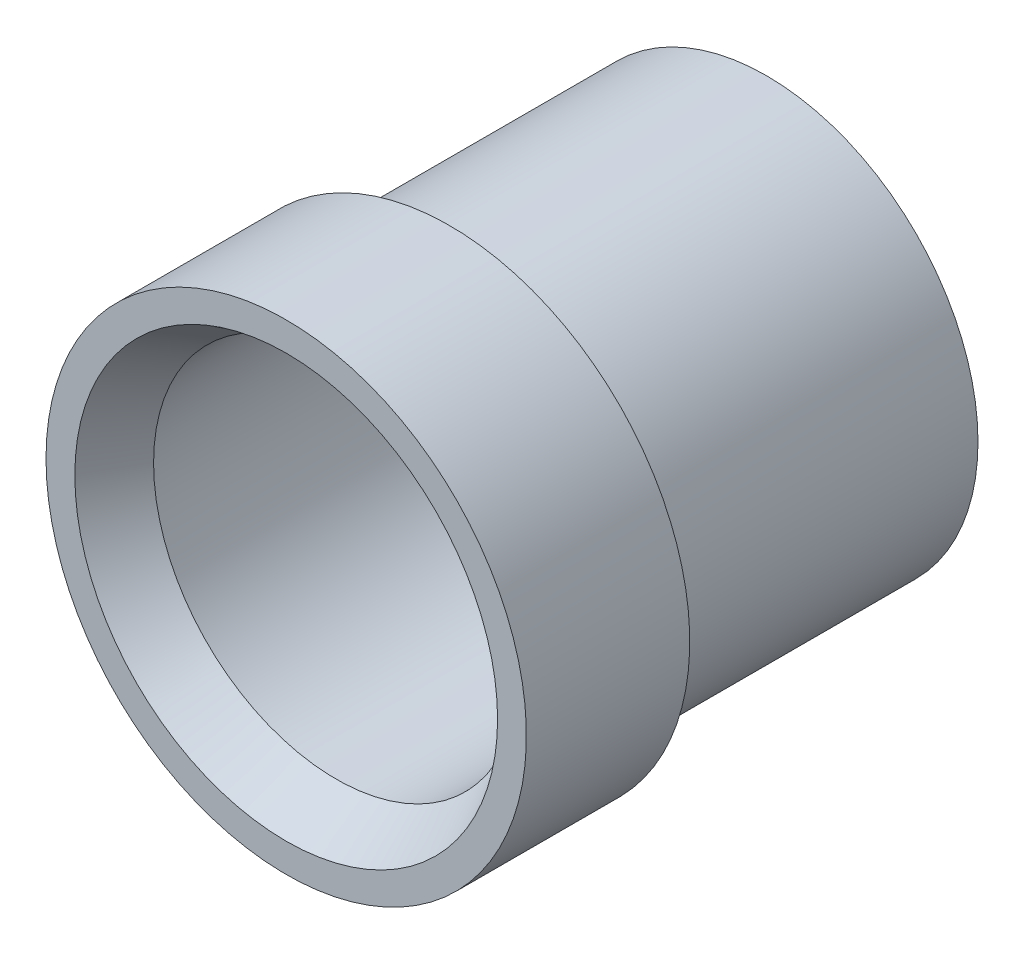
ISO-10303-21;
HEADER;
FILE_DESCRIPTION(('STEP AP214'),'2;1');
FILE_NAME('part.step','',(''),(''),'','','');
FILE_SCHEMA(('AUTOMOTIVE_DESIGN { 1 0 10303 214 1 1 1 1 }'));
ENDSEC;
DATA;
#1=APPLICATION_CONTEXT('core data for automotive mechanical design processes');
#2=APPLICATION_PROTOCOL_DEFINITION('international standard','automotive_design',2000,#1);
#3=PRODUCT_CONTEXT('',#1,'mechanical');
#4=PRODUCT('Part','Part','',(#3));
#5=PRODUCT_RELATED_PRODUCT_CATEGORY('part','',(#4));
#6=PRODUCT_DEFINITION_FORMATION('','',#4);
#7=PRODUCT_DEFINITION_CONTEXT('part definition',#1,'design');
#8=PRODUCT_DEFINITION('design','',#6,#7);
#9=PRODUCT_DEFINITION_SHAPE('','',#8);
#10=(LENGTH_UNIT() NAMED_UNIT(*) SI_UNIT(.MILLI.,.METRE.));
#11=(NAMED_UNIT(*) PLANE_ANGLE_UNIT() SI_UNIT($,.RADIAN.));
#12=(NAMED_UNIT(*) SI_UNIT($,.STERADIAN.) SOLID_ANGLE_UNIT());
#13=UNCERTAINTY_MEASURE_WITH_UNIT(LENGTH_MEASURE(1.E-05),#10,'distance_accuracy_value','');
#14=(GEOMETRIC_REPRESENTATION_CONTEXT(3) GLOBAL_UNCERTAINTY_ASSIGNED_CONTEXT((#13)) GLOBAL_UNIT_ASSIGNED_CONTEXT((#10,
#11,#12)) REPRESENTATION_CONTEXT('',''));
#15=CARTESIAN_POINT('',(0.,0.,0.));
#16=DIRECTION('',(0.,0.,1.));
#17=DIRECTION('',(1.,0.,0.));
#18=AXIS2_PLACEMENT_3D('',#15,#16,#17);
#19=CARTESIAN_POINT('',(0.,6.35,6.35));
#20=DIRECTION('',(0.,0.,1.));
#21=DIRECTION('',(1.,0.,0.));
#22=AXIS2_PLACEMENT_3D('',#19,#20,#21);
#23=PLANE('',#22);
#24=CARTESIAN_POINT('',(0.,0.,6.35));
#25=DIRECTION('',(0.,0.,-1.));
#26=DIRECTION('',(-1.,0.,0.));
#27=AXIS2_PLACEMENT_3D('',#24,#25,#26);
#28=CIRCLE('',#27,5.588);
#29=CARTESIAN_POINT('',(-5.588,0.,6.35));
#30=VERTEX_POINT('',#29);
#31=EDGE_CURVE('E10',#30,#30,#28,.T.);
#32=ORIENTED_EDGE('',*,*,#31,.T.);
#33=EDGE_LOOP('',(#32));
#34=FACE_BOUND('',#33,.T.);
#35=CARTESIAN_POINT('',(0.,0.,6.35));
#36=DIRECTION('',(0.,0.,-1.));
#37=DIRECTION('',(-1.,0.,0.));
#38=AXIS2_PLACEMENT_3D('',#35,#36,#37);
#39=CIRCLE('',#38,6.35);
#40=CARTESIAN_POINT('',(-6.35,0.,6.35));
#41=VERTEX_POINT('',#40);
#42=EDGE_CURVE('E58',#41,#41,#39,.T.);
#43=ORIENTED_EDGE('',*,*,#42,.F.);
#44=EDGE_LOOP('',(#43));
#45=FACE_BOUND('',#44,.T.);
#46=ADVANCED_FACE('F33',(#34,#45),#23,.T.);
#47=CARTESIAN_POINT('',(0.,0.,6.35));
#48=DIRECTION('',(0.,0.,1.));
#49=DIRECTION('',(1.,0.,0.));
#50=AXIS2_PLACEMENT_3D('',#47,#48,#49);
#51=CONICAL_SURFACE('',#50,5.588,0.523598775598299);
#52=CARTESIAN_POINT('',(0.,0.,5.03017728463252));
#53=DIRECTION('',(0.,0.,-1.));
#54=DIRECTION('',(-1.,0.,0.));
#55=AXIS2_PLACEMENT_3D('',#52,#53,#54);
#56=CIRCLE('',#55,4.826);
#57=CARTESIAN_POINT('',(-4.826,0.,5.03017728463252));
#58=VERTEX_POINT('',#57);
#59=EDGE_CURVE('E39',#58,#58,#56,.T.);
#60=ORIENTED_EDGE('',*,*,#59,.T.);
#61=EDGE_LOOP('',(#60));
#62=FACE_BOUND('',#61,.T.);
#63=ORIENTED_EDGE('',*,*,#31,.F.);
#64=EDGE_LOOP('',(#63));
#65=FACE_BOUND('',#64,.T.);
#66=ADVANCED_FACE('F66',(#62,#65),#51,.F.);
#67=CARTESIAN_POINT('',(0.,0.,-6.35));
#68=DIRECTION('',(0.,0.,-1.));
#69=DIRECTION('',(-1.,0.,0.));
#70=AXIS2_PLACEMENT_3D('',#67,#68,#69);
#71=CYLINDRICAL_SURFACE('',#70,4.826);
#72=CARTESIAN_POINT('',(0.,0.,-6.35));
#73=DIRECTION('',(0.,0.,-1.));
#74=DIRECTION('',(-1.,0.,0.));
#75=AXIS2_PLACEMENT_3D('',#72,#73,#74);
#76=CIRCLE('',#75,4.826);
#77=CARTESIAN_POINT('',(-4.826,0.,-6.35));
#78=VERTEX_POINT('',#77);
#79=EDGE_CURVE('E43',#78,#78,#76,.T.);
#80=ORIENTED_EDGE('',*,*,#79,.T.);
#81=EDGE_LOOP('',(#80));
#82=FACE_BOUND('',#81,.T.);
#83=ORIENTED_EDGE('',*,*,#59,.F.);
#84=EDGE_LOOP('',(#83));
#85=FACE_BOUND('',#84,.T.);
#86=ADVANCED_FACE('F70',(#82,#85),#71,.F.);
#87=CARTESIAN_POINT('',(0.,4.826,-6.35));
#88=DIRECTION('',(0.,0.,-1.));
#89=DIRECTION('',(-1.,0.,0.));
#90=AXIS2_PLACEMENT_3D('',#87,#88,#89);
#91=PLANE('',#90);
#92=CARTESIAN_POINT('',(0.,0.,-6.35));
#93=DIRECTION('',(0.,0.,-1.));
#94=DIRECTION('',(-1.,0.,0.));
#95=AXIS2_PLACEMENT_3D('',#92,#93,#94);
#96=CIRCLE('',#95,5.588);
#97=CARTESIAN_POINT('',(-5.588,0.,-6.35));
#98=VERTEX_POINT('',#97);
#99=EDGE_CURVE('E47',#98,#98,#96,.T.);
#100=ORIENTED_EDGE('',*,*,#99,.T.);
#101=EDGE_LOOP('',(#100));
#102=FACE_BOUND('',#101,.T.);
#103=ORIENTED_EDGE('',*,*,#79,.F.);
#104=EDGE_LOOP('',(#103));
#105=FACE_BOUND('',#104,.T.);
#106=ADVANCED_FACE('F74',(#102,#105),#91,.T.);
#107=CARTESIAN_POINT('',(0.,0.,-6.35));
#108=DIRECTION('',(0.,0.,-1.));
#109=DIRECTION('',(-1.,0.,0.));
#110=AXIS2_PLACEMENT_3D('',#107,#108,#109);
#111=CYLINDRICAL_SURFACE('',#110,5.588);
#112=CARTESIAN_POINT('',(0.,0.,2.032));
#113=DIRECTION('',(0.,0.,-1.));
#114=DIRECTION('',(-1.,0.,0.));
#115=AXIS2_PLACEMENT_3D('',#112,#113,#114);
#116=CIRCLE('',#115,5.588);
#117=CARTESIAN_POINT('',(-5.588,0.,2.032));
#118=VERTEX_POINT('',#117);
#119=EDGE_CURVE('E52',#118,#118,#116,.T.);
#120=ORIENTED_EDGE('',*,*,#119,.T.);
#121=EDGE_LOOP('',(#120));
#122=FACE_BOUND('',#121,.T.);
#123=ORIENTED_EDGE('',*,*,#99,.F.);
#124=EDGE_LOOP('',(#123));
#125=FACE_BOUND('',#124,.T.);
#126=ADVANCED_FACE('F81',(#122,#125),#111,.T.);
#127=CARTESIAN_POINT('',(0.,5.588,2.032));
#128=DIRECTION('',(0.,0.,-1.));
#129=DIRECTION('',(-1.,0.,0.));
#130=AXIS2_PLACEMENT_3D('',#127,#128,#129);
#131=PLANE('',#130);
#132=CARTESIAN_POINT('',(0.,0.,2.032));
#133=DIRECTION('',(0.,0.,-1.));
#134=DIRECTION('',(-1.,0.,0.));
#135=AXIS2_PLACEMENT_3D('',#132,#133,#134);
#136=CIRCLE('',#135,6.35);
#137=CARTESIAN_POINT('',(-6.35,0.,2.032));
#138=VERTEX_POINT('',#137);
#139=EDGE_CURVE('E55',#138,#138,#136,.T.);
#140=ORIENTED_EDGE('',*,*,#139,.T.);
#141=EDGE_LOOP('',(#140));
#142=FACE_BOUND('',#141,.T.);
#143=ORIENTED_EDGE('',*,*,#119,.F.);
#144=EDGE_LOOP('',(#143));
#145=FACE_BOUND('',#144,.T.);
#146=ADVANCED_FACE('F85',(#142,#145),#131,.T.);
#147=CARTESIAN_POINT('',(0.,0.,-6.35));
#148=DIRECTION('',(0.,0.,-1.));
#149=DIRECTION('',(-1.,0.,0.));
#150=AXIS2_PLACEMENT_3D('',#147,#148,#149);
#151=CYLINDRICAL_SURFACE('',#150,6.35);
#152=ORIENTED_EDGE('',*,*,#42,.T.);
#153=EDGE_LOOP('',(#152));
#154=FACE_BOUND('',#153,.T.);
#155=ORIENTED_EDGE('',*,*,#139,.F.);
#156=EDGE_LOOP('',(#155));
#157=FACE_BOUND('',#156,.T.);
#158=ADVANCED_FACE('F62',(#154,#157),#151,.T.);
#159=CLOSED_SHELL('',(#46,#66,#86,#106,#126,#146,#158));
#160=MANIFOLD_SOLID_BREP('B2',#159);
#161=ADVANCED_BREP_SHAPE_REPRESENTATION('',(#18,#160),#14);
#162=SHAPE_DEFINITION_REPRESENTATION(#9,#161);
ENDSEC;
END-ISO-10303-21;
